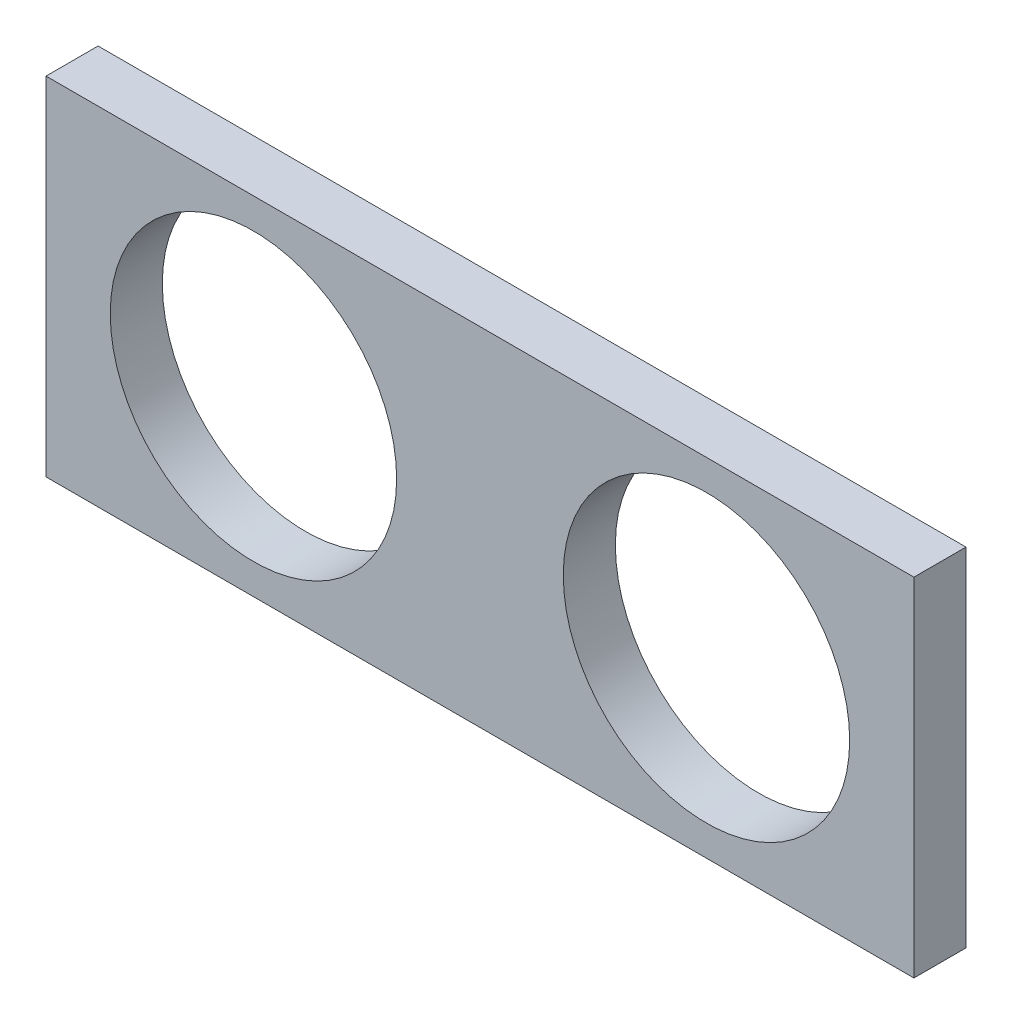
ISO-10303-21;
HEADER;
FILE_DESCRIPTION(('STEP AP214'),'2;1');
FILE_NAME('part.step','',(''),(''),'','','');
FILE_SCHEMA(('AUTOMOTIVE_DESIGN { 1 0 10303 214 1 1 1 1 }'));
ENDSEC;
DATA;
#1=APPLICATION_CONTEXT('core data for automotive mechanical design processes');
#2=APPLICATION_PROTOCOL_DEFINITION('international standard','automotive_design',2000,#1);
#3=PRODUCT_CONTEXT('',#1,'mechanical');
#4=PRODUCT('Part','Part','',(#3));
#5=PRODUCT_RELATED_PRODUCT_CATEGORY('part','',(#4));
#6=PRODUCT_DEFINITION_FORMATION('','',#4);
#7=PRODUCT_DEFINITION_CONTEXT('part definition',#1,'design');
#8=PRODUCT_DEFINITION('design','',#6,#7);
#9=PRODUCT_DEFINITION_SHAPE('','',#8);
#10=(LENGTH_UNIT() NAMED_UNIT(*) SI_UNIT(.MILLI.,.METRE.));
#11=(NAMED_UNIT(*) PLANE_ANGLE_UNIT() SI_UNIT($,.RADIAN.));
#12=(NAMED_UNIT(*) SI_UNIT($,.STERADIAN.) SOLID_ANGLE_UNIT());
#13=UNCERTAINTY_MEASURE_WITH_UNIT(LENGTH_MEASURE(1.E-05),#10,'distance_accuracy_value','');
#14=(GEOMETRIC_REPRESENTATION_CONTEXT(3) GLOBAL_UNCERTAINTY_ASSIGNED_CONTEXT((#13)) GLOBAL_UNIT_ASSIGNED_CONTEXT((#10,
#11,#12)) REPRESENTATION_CONTEXT('',''));
#15=CARTESIAN_POINT('',(0.,0.,0.));
#16=DIRECTION('',(0.,0.,1.));
#17=DIRECTION('',(1.,0.,0.));
#18=AXIS2_PLACEMENT_3D('',#15,#16,#17);
#19=CARTESIAN_POINT('',(0.,0.,3.));
#20=DIRECTION('',(0.,0.,-1.));
#21=DIRECTION('',(-1.,0.,0.));
#22=AXIS2_PLACEMENT_3D('',#19,#20,#21);
#23=PLANE('',#22);
#24=DIRECTION('',(0.,1.,0.));
#25=VECTOR('',#24,1.);
#26=CARTESIAN_POINT('',(25.,-10.,3.));
#27=LINE('',#26,#25);
#28=CARTESIAN_POINT('',(25.,-10.,3.));
#29=VERTEX_POINT('',#28);
#30=CARTESIAN_POINT('',(25.,10.,3.));
#31=VERTEX_POINT('',#30);
#32=EDGE_CURVE('E96',#29,#31,#27,.T.);
#33=ORIENTED_EDGE('',*,*,#32,.T.);
#34=DIRECTION('',(-1.,0.,0.));
#35=VECTOR('',#34,1.);
#36=CARTESIAN_POINT('',(-25.,10.,3.));
#37=LINE('',#36,#35);
#38=CARTESIAN_POINT('',(-25.,10.,3.));
#39=VERTEX_POINT('',#38);
#40=EDGE_CURVE('E91',#31,#39,#37,.T.);
#41=ORIENTED_EDGE('',*,*,#40,.T.);
#42=DIRECTION('',(0.,-1.,0.));
#43=VECTOR('',#42,1.);
#44=CARTESIAN_POINT('',(-25.,-10.,3.));
#45=LINE('',#44,#43);
#46=CARTESIAN_POINT('',(-25.,-10.,3.));
#47=VERTEX_POINT('',#46);
#48=EDGE_CURVE('E94',#39,#47,#45,.T.);
#49=ORIENTED_EDGE('',*,*,#48,.T.);
#50=DIRECTION('',(1.,0.,0.));
#51=VECTOR('',#50,1.);
#52=CARTESIAN_POINT('',(-25.,-10.,3.));
#53=LINE('',#52,#51);
#54=EDGE_CURVE('E61',#47,#29,#53,.T.);
#55=ORIENTED_EDGE('',*,*,#54,.T.);
#56=EDGE_LOOP('',(#33,#41,#49,#55));
#57=FACE_BOUND('',#56,.T.);
#58=CARTESIAN_POINT('',(-13.05,0.,3.));
#59=DIRECTION('',(0.,0.,1.));
#60=DIRECTION('',(1.,0.,0.));
#61=AXIS2_PLACEMENT_3D('',#58,#59,#60);
#62=CIRCLE('',#61,8.25);
#63=CARTESIAN_POINT('',(-4.80000000000002,0.,3.));
#64=VERTEX_POINT('',#63);
#65=EDGE_CURVE('E116',#64,#64,#62,.T.);
#66=ORIENTED_EDGE('',*,*,#65,.F.);
#67=EDGE_LOOP('',(#66));
#68=FACE_BOUND('',#67,.T.);
#69=CARTESIAN_POINT('',(13.05,0.,3.));
#70=DIRECTION('',(0.,0.,1.));
#71=DIRECTION('',(1.,0.,0.));
#72=AXIS2_PLACEMENT_3D('',#69,#70,#71);
#73=CIRCLE('',#72,8.25);
#74=CARTESIAN_POINT('',(21.3,0.,3.));
#75=VERTEX_POINT('',#74);
#76=EDGE_CURVE('E138',#75,#75,#73,.T.);
#77=ORIENTED_EDGE('',*,*,#76,.F.);
#78=EDGE_LOOP('',(#77));
#79=FACE_BOUND('',#78,.T.);
#80=ADVANCED_FACE('F43',(#57,#68,#79),#23,.F.);
#81=CARTESIAN_POINT('',(0.,0.,0.));
#82=DIRECTION('',(0.,0.,-1.));
#83=DIRECTION('',(-1.,0.,0.));
#84=AXIS2_PLACEMENT_3D('',#81,#82,#83);
#85=PLANE('',#84);
#86=CARTESIAN_POINT('',(-13.05,0.,0.));
#87=DIRECTION('',(0.,0.,1.));
#88=DIRECTION('',(1.,0.,0.));
#89=AXIS2_PLACEMENT_3D('',#86,#87,#88);
#90=CIRCLE('',#89,8.25);
#91=CARTESIAN_POINT('',(-4.80000000000002,0.,0.));
#92=VERTEX_POINT('',#91);
#93=EDGE_CURVE('E134',#92,#92,#90,.T.);
#94=ORIENTED_EDGE('',*,*,#93,.T.);
#95=EDGE_LOOP('',(#94));
#96=FACE_BOUND('',#95,.T.);
#97=DIRECTION('',(0.,1.,0.));
#98=VECTOR('',#97,1.);
#99=CARTESIAN_POINT('',(25.,-10.,0.));
#100=LINE('',#99,#98);
#101=CARTESIAN_POINT('',(25.,-10.,0.));
#102=VERTEX_POINT('',#101);
#103=CARTESIAN_POINT('',(25.,10.,0.));
#104=VERTEX_POINT('',#103);
#105=EDGE_CURVE('E112',#102,#104,#100,.T.);
#106=ORIENTED_EDGE('',*,*,#105,.F.);
#107=DIRECTION('',(1.,0.,0.));
#108=VECTOR('',#107,1.);
#109=CARTESIAN_POINT('',(-25.,-10.,0.));
#110=LINE('',#109,#108);
#111=CARTESIAN_POINT('',(-25.,-10.,0.));
#112=VERTEX_POINT('',#111);
#113=EDGE_CURVE('E84',#112,#102,#110,.T.);
#114=ORIENTED_EDGE('',*,*,#113,.F.);
#115=DIRECTION('',(0.,-1.,0.));
#116=VECTOR('',#115,1.);
#117=CARTESIAN_POINT('',(-25.,-10.,0.));
#118=LINE('',#117,#116);
#119=CARTESIAN_POINT('',(-25.,10.,0.));
#120=VERTEX_POINT('',#119);
#121=EDGE_CURVE('E78',#120,#112,#118,.T.);
#122=ORIENTED_EDGE('',*,*,#121,.F.);
#123=DIRECTION('',(-1.,0.,0.));
#124=VECTOR('',#123,1.);
#125=CARTESIAN_POINT('',(-25.,10.,0.));
#126=LINE('',#125,#124);
#127=EDGE_CURVE('E101',#104,#120,#126,.T.);
#128=ORIENTED_EDGE('',*,*,#127,.F.);
#129=EDGE_LOOP('',(#106,#114,#122,#128));
#130=FACE_BOUND('',#129,.T.);
#131=CARTESIAN_POINT('',(13.05,0.,0.));
#132=DIRECTION('',(0.,0.,1.));
#133=DIRECTION('',(1.,0.,0.));
#134=AXIS2_PLACEMENT_3D('',#131,#132,#133);
#135=CIRCLE('',#134,8.25);
#136=CARTESIAN_POINT('',(21.3,0.,0.));
#137=VERTEX_POINT('',#136);
#138=EDGE_CURVE('E142',#137,#137,#135,.T.);
#139=ORIENTED_EDGE('',*,*,#138,.T.);
#140=EDGE_LOOP('',(#139));
#141=FACE_BOUND('',#140,.T.);
#142=ADVANCED_FACE('F129',(#96,#130,#141),#85,.T.);
#143=CARTESIAN_POINT('',(25.,-10.,3.));
#144=DIRECTION('',(-1.,0.,0.));
#145=DIRECTION('',(0.,0.,1.));
#146=AXIS2_PLACEMENT_3D('',#143,#144,#145);
#147=PLANE('',#146);
#148=ORIENTED_EDGE('',*,*,#105,.T.);
#149=DIRECTION('',(0.,0.,-1.));
#150=VECTOR('',#149,1.);
#151=CARTESIAN_POINT('',(25.,10.,3.));
#152=LINE('',#151,#150);
#153=EDGE_CURVE('E11',#31,#104,#152,.T.);
#154=ORIENTED_EDGE('',*,*,#153,.F.);
#155=ORIENTED_EDGE('',*,*,#32,.F.);
#156=DIRECTION('',(0.,0.,-1.));
#157=VECTOR('',#156,1.);
#158=CARTESIAN_POINT('',(25.,-10.,3.));
#159=LINE('',#158,#157);
#160=EDGE_CURVE('E108',#29,#102,#159,.T.);
#161=ORIENTED_EDGE('',*,*,#160,.T.);
#162=EDGE_LOOP('',(#148,#154,#155,#161));
#163=FACE_BOUND('',#162,.T.);
#164=ADVANCED_FACE('F45',(#163),#147,.F.);
#165=CARTESIAN_POINT('',(-25.,10.,3.));
#166=DIRECTION('',(0.,-1.,0.));
#167=DIRECTION('',(0.,0.,-1.));
#168=AXIS2_PLACEMENT_3D('',#165,#166,#167);
#169=PLANE('',#168);
#170=ORIENTED_EDGE('',*,*,#127,.T.);
#171=DIRECTION('',(0.,0.,-1.));
#172=VECTOR('',#171,1.);
#173=CARTESIAN_POINT('',(-25.,10.,3.));
#174=LINE('',#173,#172);
#175=EDGE_CURVE('E53',#39,#120,#174,.T.);
#176=ORIENTED_EDGE('',*,*,#175,.F.);
#177=ORIENTED_EDGE('',*,*,#40,.F.);
#178=ORIENTED_EDGE('',*,*,#153,.T.);
#179=EDGE_LOOP('',(#170,#176,#177,#178));
#180=FACE_BOUND('',#179,.T.);
#181=ADVANCED_FACE('F100',(#180),#169,.F.);
#182=CARTESIAN_POINT('',(-25.,-10.,3.));
#183=DIRECTION('',(1.,0.,0.));
#184=DIRECTION('',(0.,0.,-1.));
#185=AXIS2_PLACEMENT_3D('',#182,#183,#184);
#186=PLANE('',#185);
#187=ORIENTED_EDGE('',*,*,#121,.T.);
#188=DIRECTION('',(0.,0.,-1.));
#189=VECTOR('',#188,1.);
#190=CARTESIAN_POINT('',(-25.,-10.,3.));
#191=LINE('',#190,#189);
#192=EDGE_CURVE('E103',#47,#112,#191,.T.);
#193=ORIENTED_EDGE('',*,*,#192,.F.);
#194=ORIENTED_EDGE('',*,*,#48,.F.);
#195=ORIENTED_EDGE('',*,*,#175,.T.);
#196=EDGE_LOOP('',(#187,#193,#194,#195));
#197=FACE_BOUND('',#196,.T.);
#198=ADVANCED_FACE('F104',(#197),#186,.F.);
#199=CARTESIAN_POINT('',(-25.,-10.,3.));
#200=DIRECTION('',(0.,1.,0.));
#201=DIRECTION('',(0.,0.,1.));
#202=AXIS2_PLACEMENT_3D('',#199,#200,#201);
#203=PLANE('',#202);
#204=ORIENTED_EDGE('',*,*,#113,.T.);
#205=ORIENTED_EDGE('',*,*,#160,.F.);
#206=ORIENTED_EDGE('',*,*,#54,.F.);
#207=ORIENTED_EDGE('',*,*,#192,.T.);
#208=EDGE_LOOP('',(#204,#205,#206,#207));
#209=FACE_BOUND('',#208,.T.);
#210=ADVANCED_FACE('F126',(#209),#203,.F.);
#211=CARTESIAN_POINT('',(-13.05,0.,3.));
#212=DIRECTION('',(0.,0.,-1.));
#213=DIRECTION('',(-1.,0.,0.));
#214=AXIS2_PLACEMENT_3D('',#211,#212,#213);
#215=CYLINDRICAL_SURFACE('',#214,8.25);
#216=ORIENTED_EDGE('',*,*,#65,.T.);
#217=EDGE_LOOP('',(#216));
#218=FACE_BOUND('',#217,.T.);
#219=ORIENTED_EDGE('',*,*,#93,.F.);
#220=EDGE_LOOP('',(#219));
#221=FACE_BOUND('',#220,.T.);
#222=ADVANCED_FACE('F161',(#218,#221),#215,.F.);
#223=CARTESIAN_POINT('',(13.05,0.,3.));
#224=DIRECTION('',(0.,0.,-1.));
#225=DIRECTION('',(-1.,0.,0.));
#226=AXIS2_PLACEMENT_3D('',#223,#224,#225);
#227=CYLINDRICAL_SURFACE('',#226,8.25);
#228=ORIENTED_EDGE('',*,*,#76,.T.);
#229=EDGE_LOOP('',(#228));
#230=FACE_BOUND('',#229,.T.);
#231=ORIENTED_EDGE('',*,*,#138,.F.);
#232=EDGE_LOOP('',(#231));
#233=FACE_BOUND('',#232,.T.);
#234=ADVANCED_FACE('F150',(#230,#233),#227,.F.);
#235=CLOSED_SHELL('',(#80,#142,#164,#181,#198,#210,#222,#234));
#236=MANIFOLD_SOLID_BREP('B2',#235);
#237=ADVANCED_BREP_SHAPE_REPRESENTATION('',(#18,#236),#14);
#238=SHAPE_DEFINITION_REPRESENTATION(#9,#237);
ENDSEC;
END-ISO-10303-21;
